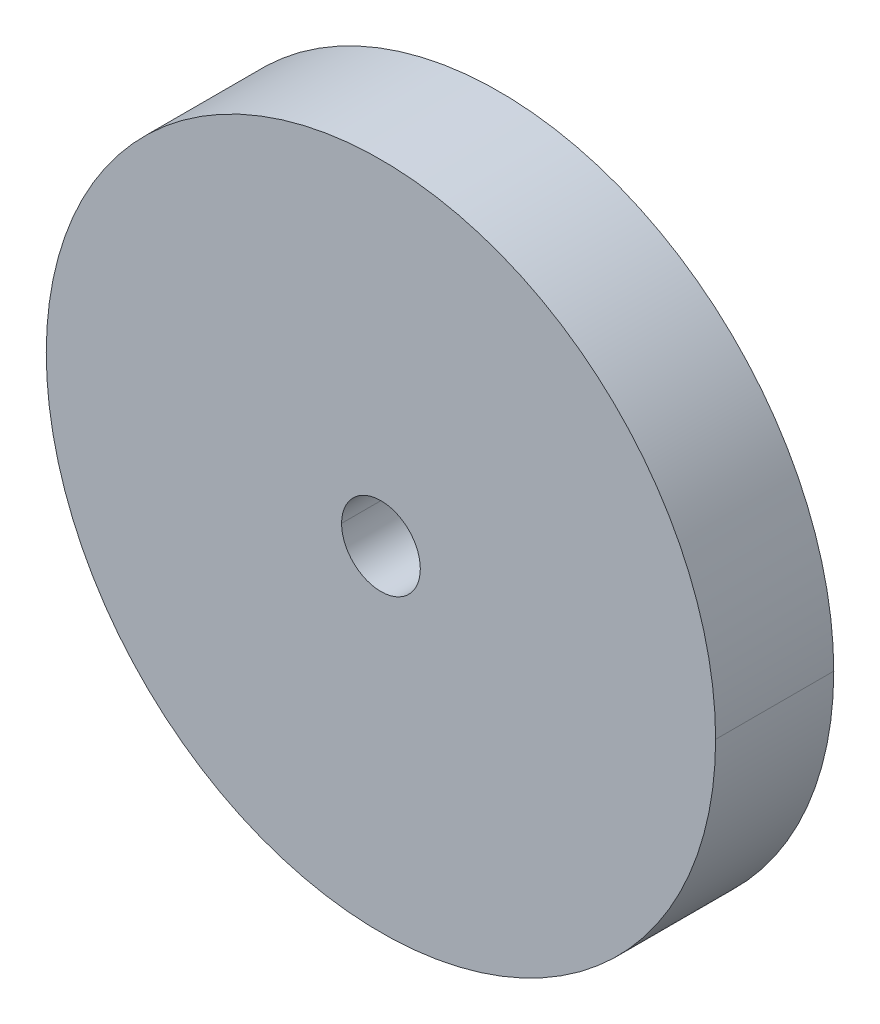
ISO-10303-21;
HEADER;
FILE_DESCRIPTION(('STEP AP214'),'2;1');
FILE_NAME('part.step','',(''),(''),'','','');
FILE_SCHEMA(('AUTOMOTIVE_DESIGN { 1 0 10303 214 1 1 1 1 }'));
ENDSEC;
DATA;
#1=APPLICATION_CONTEXT('core data for automotive mechanical design processes');
#2=APPLICATION_PROTOCOL_DEFINITION('international standard','automotive_design',2000,#1);
#3=PRODUCT_CONTEXT('',#1,'mechanical');
#4=PRODUCT('Part','Part','',(#3));
#5=PRODUCT_RELATED_PRODUCT_CATEGORY('part','',(#4));
#6=PRODUCT_DEFINITION_FORMATION('','',#4);
#7=PRODUCT_DEFINITION_CONTEXT('part definition',#1,'design');
#8=PRODUCT_DEFINITION('design','',#6,#7);
#9=PRODUCT_DEFINITION_SHAPE('','',#8);
#10=(LENGTH_UNIT() NAMED_UNIT(*) SI_UNIT(.MILLI.,.METRE.));
#11=(NAMED_UNIT(*) PLANE_ANGLE_UNIT() SI_UNIT($,.RADIAN.));
#12=(NAMED_UNIT(*) SI_UNIT($,.STERADIAN.) SOLID_ANGLE_UNIT());
#13=UNCERTAINTY_MEASURE_WITH_UNIT(LENGTH_MEASURE(1.E-05),#10,'distance_accuracy_value','');
#14=(GEOMETRIC_REPRESENTATION_CONTEXT(3) GLOBAL_UNCERTAINTY_ASSIGNED_CONTEXT((#13)) GLOBAL_UNIT_ASSIGNED_CONTEXT((#10,
#11,#12)) REPRESENTATION_CONTEXT('',''));
#15=CARTESIAN_POINT('',(0.,0.,0.));
#16=DIRECTION('',(0.,0.,1.));
#17=DIRECTION('',(1.,0.,0.));
#18=AXIS2_PLACEMENT_3D('',#15,#16,#17);
#19=CARTESIAN_POINT('',(0.,0.,3.));
#20=DIRECTION('',(0.,0.,-1.));
#21=DIRECTION('',(-1.,0.,0.));
#22=AXIS2_PLACEMENT_3D('',#19,#20,#21);
#23=CYLINDRICAL_SURFACE('',#22,1.);
#24=DIRECTION('',(0.,0.,-1.));
#25=VECTOR('',#24,1.);
#26=CARTESIAN_POINT('',(1.,0.,3.));
#27=LINE('',#26,#25);
#28=CARTESIAN_POINT('',(1.,0.,3.));
#29=VERTEX_POINT('',#28);
#30=CARTESIAN_POINT('',(1.,0.,0.));
#31=VERTEX_POINT('',#30);
#32=EDGE_CURVE('E78',#29,#31,#27,.T.);
#33=ORIENTED_EDGE('',*,*,#32,.F.);
#34=CARTESIAN_POINT('',(0.,0.,3.));
#35=DIRECTION('',(0.,0.,1.));
#36=DIRECTION('',(1.,0.,0.));
#37=AXIS2_PLACEMENT_3D('',#34,#35,#36);
#38=CIRCLE('',#37,1.);
#39=CARTESIAN_POINT('',(-1.,0.,3.));
#40=VERTEX_POINT('',#39);
#41=EDGE_CURVE('E73',#29,#40,#38,.T.);
#42=ORIENTED_EDGE('',*,*,#41,.T.);
#43=DIRECTION('',(0.,0.,-1.));
#44=VECTOR('',#43,1.);
#45=CARTESIAN_POINT('',(-1.,0.,3.));
#46=LINE('',#45,#44);
#47=CARTESIAN_POINT('',(-1.,0.,0.));
#48=VERTEX_POINT('',#47);
#49=EDGE_CURVE('E75',#40,#48,#46,.T.);
#50=ORIENTED_EDGE('',*,*,#49,.T.);
#51=CARTESIAN_POINT('',(0.,0.,0.));
#52=DIRECTION('',(0.,0.,1.));
#53=DIRECTION('',(1.,0.,0.));
#54=AXIS2_PLACEMENT_3D('',#51,#52,#53);
#55=CIRCLE('',#54,1.);
#56=EDGE_CURVE('E11',#31,#48,#55,.T.);
#57=ORIENTED_EDGE('',*,*,#56,.F.);
#58=EDGE_LOOP('',(#33,#42,#50,#57));
#59=FACE_BOUND('',#58,.T.);
#60=ADVANCED_FACE('F17',(#59),#23,.F.);
#61=CARTESIAN_POINT('',(0.,0.,3.));
#62=DIRECTION('',(0.,0.,-1.));
#63=DIRECTION('',(-1.,0.,0.));
#64=AXIS2_PLACEMENT_3D('',#61,#62,#63);
#65=CYLINDRICAL_SURFACE('',#64,8.5);
#66=DIRECTION('',(0.,0.,-1.));
#67=VECTOR('',#66,1.);
#68=CARTESIAN_POINT('',(8.5,0.,3.));
#69=LINE('',#68,#67);
#70=CARTESIAN_POINT('',(8.5,0.,3.));
#71=VERTEX_POINT('',#70);
#72=CARTESIAN_POINT('',(8.5,0.,0.));
#73=VERTEX_POINT('',#72);
#74=EDGE_CURVE('E105',#71,#73,#69,.T.);
#75=ORIENTED_EDGE('',*,*,#74,.F.);
#76=CARTESIAN_POINT('',(0.,0.,3.));
#77=DIRECTION('',(0.,0.,1.));
#78=DIRECTION('',(1.,0.,0.));
#79=AXIS2_PLACEMENT_3D('',#76,#77,#78);
#80=CIRCLE('',#79,8.5);
#81=CARTESIAN_POINT('',(-8.5,0.,3.));
#82=VERTEX_POINT('',#81);
#83=EDGE_CURVE('E83',#82,#71,#80,.T.);
#84=ORIENTED_EDGE('',*,*,#83,.F.);
#85=DIRECTION('',(0.,0.,-1.));
#86=VECTOR('',#85,1.);
#87=CARTESIAN_POINT('',(-8.5,0.,3.));
#88=LINE('',#87,#86);
#89=CARTESIAN_POINT('',(-8.5,0.,0.));
#90=VERTEX_POINT('',#89);
#91=EDGE_CURVE('E116',#82,#90,#88,.T.);
#92=ORIENTED_EDGE('',*,*,#91,.T.);
#93=CARTESIAN_POINT('',(0.,0.,0.));
#94=DIRECTION('',(0.,0.,1.));
#95=DIRECTION('',(1.,0.,0.));
#96=AXIS2_PLACEMENT_3D('',#93,#94,#95);
#97=CIRCLE('',#96,8.5);
#98=EDGE_CURVE('E21',#90,#73,#97,.T.);
#99=ORIENTED_EDGE('',*,*,#98,.T.);
#100=EDGE_LOOP('',(#75,#84,#92,#99));
#101=FACE_BOUND('',#100,.T.);
#102=ADVANCED_FACE('F123',(#101),#65,.T.);
#103=CARTESIAN_POINT('',(0.,0.,0.));
#104=DIRECTION('',(0.,0.,1.));
#105=DIRECTION('',(1.,0.,0.));
#106=AXIS2_PLACEMENT_3D('',#103,#104,#105);
#107=PLANE('',#106);
#108=CARTESIAN_POINT('',(0.,0.,0.));
#109=DIRECTION('',(0.,0.,1.));
#110=DIRECTION('',(1.,0.,0.));
#111=AXIS2_PLACEMENT_3D('',#108,#109,#110);
#112=CIRCLE('',#111,1.);
#113=EDGE_CURVE('E89',#48,#31,#112,.T.);
#114=ORIENTED_EDGE('',*,*,#113,.T.);
#115=ORIENTED_EDGE('',*,*,#56,.T.);
#116=EDGE_LOOP('',(#114,#115));
#117=FACE_BOUND('',#116,.T.);
#118=ORIENTED_EDGE('',*,*,#98,.F.);
#119=CARTESIAN_POINT('',(0.,0.,0.));
#120=DIRECTION('',(0.,0.,1.));
#121=DIRECTION('',(1.,0.,0.));
#122=AXIS2_PLACEMENT_3D('',#119,#120,#121);
#123=CIRCLE('',#122,8.5);
#124=EDGE_CURVE('E108',#73,#90,#123,.T.);
#125=ORIENTED_EDGE('',*,*,#124,.F.);
#126=EDGE_LOOP('',(#118,#125));
#127=FACE_BOUND('',#126,.T.);
#128=ADVANCED_FACE('F19',(#117,#127),#107,.F.);
#129=CARTESIAN_POINT('',(0.,0.,3.));
#130=DIRECTION('',(0.,0.,1.));
#131=DIRECTION('',(1.,0.,0.));
#132=AXIS2_PLACEMENT_3D('',#129,#130,#131);
#133=PLANE('',#132);
#134=CARTESIAN_POINT('',(0.,0.,3.));
#135=DIRECTION('',(0.,0.,1.));
#136=DIRECTION('',(1.,0.,0.));
#137=AXIS2_PLACEMENT_3D('',#134,#135,#136);
#138=CIRCLE('',#137,1.);
#139=EDGE_CURVE('E87',#40,#29,#138,.T.);
#140=ORIENTED_EDGE('',*,*,#139,.F.);
#141=ORIENTED_EDGE('',*,*,#41,.F.);
#142=EDGE_LOOP('',(#140,#141));
#143=FACE_BOUND('',#142,.T.);
#144=ORIENTED_EDGE('',*,*,#83,.T.);
#145=CARTESIAN_POINT('',(0.,0.,3.));
#146=DIRECTION('',(0.,0.,1.));
#147=DIRECTION('',(1.,0.,0.));
#148=AXIS2_PLACEMENT_3D('',#145,#146,#147);
#149=CIRCLE('',#148,8.5);
#150=EDGE_CURVE('E91',#71,#82,#149,.T.);
#151=ORIENTED_EDGE('',*,*,#150,.T.);
#152=EDGE_LOOP('',(#144,#151));
#153=FACE_BOUND('',#152,.T.);
#154=ADVANCED_FACE('F93',(#143,#153),#133,.T.);
#155=CARTESIAN_POINT('',(0.,0.,3.));
#156=DIRECTION('',(0.,0.,-1.));
#157=DIRECTION('',(-1.,0.,0.));
#158=AXIS2_PLACEMENT_3D('',#155,#156,#157);
#159=CYLINDRICAL_SURFACE('',#158,8.5);
#160=ORIENTED_EDGE('',*,*,#150,.F.);
#161=ORIENTED_EDGE('',*,*,#74,.T.);
#162=ORIENTED_EDGE('',*,*,#124,.T.);
#163=ORIENTED_EDGE('',*,*,#91,.F.);
#164=EDGE_LOOP('',(#160,#161,#162,#163));
#165=FACE_BOUND('',#164,.T.);
#166=ADVANCED_FACE('F125',(#165),#159,.T.);
#167=CARTESIAN_POINT('',(0.,0.,3.));
#168=DIRECTION('',(0.,0.,-1.));
#169=DIRECTION('',(-1.,0.,0.));
#170=AXIS2_PLACEMENT_3D('',#167,#168,#169);
#171=CYLINDRICAL_SURFACE('',#170,1.);
#172=ORIENTED_EDGE('',*,*,#139,.T.);
#173=ORIENTED_EDGE('',*,*,#32,.T.);
#174=ORIENTED_EDGE('',*,*,#113,.F.);
#175=ORIENTED_EDGE('',*,*,#49,.F.);
#176=EDGE_LOOP('',(#172,#173,#174,#175));
#177=FACE_BOUND('',#176,.T.);
#178=ADVANCED_FACE('F86',(#177),#171,.F.);
#179=CLOSED_SHELL('',(#60,#102,#128,#154,#166,#178));
#180=MANIFOLD_SOLID_BREP('B1',#179);
#181=ADVANCED_BREP_SHAPE_REPRESENTATION('',(#18,#180),#14);
#182=SHAPE_DEFINITION_REPRESENTATION(#9,#181);
ENDSEC;
END-ISO-10303-21;
